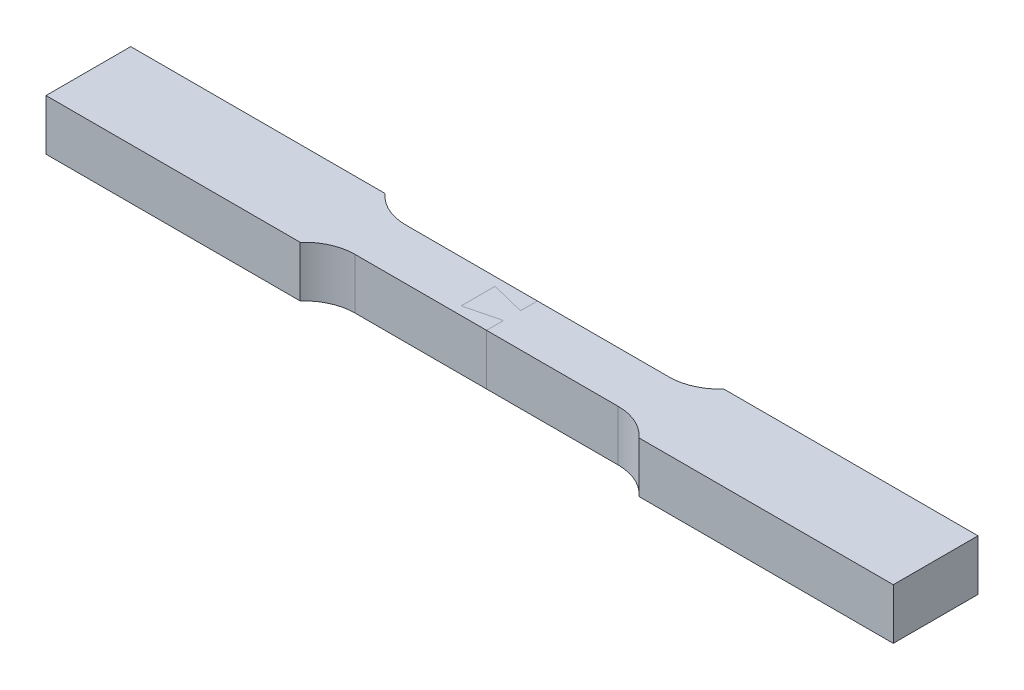
ISO-10303-21;
HEADER;
FILE_DESCRIPTION(('STEP AP214'),'2;1');
FILE_NAME('part.step','',(''),(''),'','','');
FILE_SCHEMA(('AUTOMOTIVE_DESIGN { 1 0 10303 214 1 1 1 1 }'));
ENDSEC;
DATA;
#1=APPLICATION_CONTEXT('core data for automotive mechanical design processes');
#2=APPLICATION_PROTOCOL_DEFINITION('international standard','automotive_design',2000,#1);
#3=PRODUCT_CONTEXT('',#1,'mechanical');
#4=PRODUCT('Part','Part','',(#3));
#5=PRODUCT_RELATED_PRODUCT_CATEGORY('part','',(#4));
#6=PRODUCT_DEFINITION_FORMATION('','',#4);
#7=PRODUCT_DEFINITION_CONTEXT('part definition',#1,'design');
#8=PRODUCT_DEFINITION('design','',#6,#7);
#9=PRODUCT_DEFINITION_SHAPE('','',#8);
#10=(LENGTH_UNIT() NAMED_UNIT(*) SI_UNIT(.MILLI.,.METRE.));
#11=(NAMED_UNIT(*) PLANE_ANGLE_UNIT() SI_UNIT($,.RADIAN.));
#12=(NAMED_UNIT(*) SI_UNIT($,.STERADIAN.) SOLID_ANGLE_UNIT());
#13=UNCERTAINTY_MEASURE_WITH_UNIT(LENGTH_MEASURE(1.E-05),#10,'distance_accuracy_value','');
#14=(GEOMETRIC_REPRESENTATION_CONTEXT(3) GLOBAL_UNCERTAINTY_ASSIGNED_CONTEXT((#13)) GLOBAL_UNIT_ASSIGNED_CONTEXT((#10,
#11,#12)) REPRESENTATION_CONTEXT('',''));
#15=CARTESIAN_POINT('',(0.,0.,0.));
#16=DIRECTION('',(0.,0.,1.));
#17=DIRECTION('',(1.,0.,0.));
#18=AXIS2_PLACEMENT_3D('',#15,#16,#17);
#19=CARTESIAN_POINT('',(0.,6.,3.));
#20=DIRECTION('',(0.,0.,-1.));
#21=DIRECTION('',(-1.,0.,0.));
#22=AXIS2_PLACEMENT_3D('',#19,#20,#21);
#23=PLANE('',#22);
#24=DIRECTION('',(1.,0.,0.));
#25=VECTOR('',#24,1.);
#26=CARTESIAN_POINT('',(0.,0.,3.));
#27=LINE('',#26,#25);
#28=CARTESIAN_POINT('',(0.,0.,3.));
#29=VERTEX_POINT('',#28);
#30=CARTESIAN_POINT('',(15.5278640450004,0.,3.));
#31=VERTEX_POINT('',#30);
#32=EDGE_CURVE('E178',#29,#31,#27,.T.);
#33=ORIENTED_EDGE('',*,*,#32,.T.);
#34=DIRECTION('',(0.,-1.,0.));
#35=VECTOR('',#34,1.);
#36=CARTESIAN_POINT('',(15.5278640450004,6.,3.));
#37=LINE('',#36,#35);
#38=CARTESIAN_POINT('',(15.5278640450004,6.,3.));
#39=VERTEX_POINT('',#38);
#40=EDGE_CURVE('E12',#39,#31,#37,.T.);
#41=ORIENTED_EDGE('',*,*,#40,.F.);
#42=DIRECTION('',(1.,0.,0.));
#43=VECTOR('',#42,1.);
#44=CARTESIAN_POINT('',(0.,6.,3.));
#45=LINE('',#44,#43);
#46=CARTESIAN_POINT('',(0.,6.,3.));
#47=VERTEX_POINT('',#46);
#48=EDGE_CURVE('E221',#47,#39,#45,.T.);
#49=ORIENTED_EDGE('',*,*,#48,.F.);
#50=DIRECTION('',(0.,-1.,0.));
#51=VECTOR('',#50,1.);
#52=CARTESIAN_POINT('',(0.,6.,3.));
#53=LINE('',#52,#51);
#54=EDGE_CURVE('E70',#47,#29,#53,.T.);
#55=ORIENTED_EDGE('',*,*,#54,.T.);
#56=EDGE_LOOP('',(#33,#41,#49,#55));
#57=FACE_BOUND('',#56,.T.);
#58=ADVANCED_FACE('F53',(#57),#23,.F.);
#59=CARTESIAN_POINT('',(15.5278640450004,6.,9.));
#60=DIRECTION('',(0.,-1.,0.));
#61=DIRECTION('',(0.,0.,-1.));
#62=AXIS2_PLACEMENT_3D('',#59,#60,#61);
#63=CYLINDRICAL_SURFACE('',#62,6.);
#64=CARTESIAN_POINT('',(15.5278640450004,0.,9.));
#65=DIRECTION('',(0.,1.,0.));
#66=DIRECTION('',(0.,0.,1.));
#67=AXIS2_PLACEMENT_3D('',#64,#65,#66);
#68=CIRCLE('',#67,6.);
#69=CARTESIAN_POINT('',(20.,0.,5.));
#70=VERTEX_POINT('',#69);
#71=EDGE_CURVE('E181',#31,#70,#68,.F.);
#72=ORIENTED_EDGE('',*,*,#71,.T.);
#73=DIRECTION('',(0.,-1.,0.));
#74=VECTOR('',#73,1.);
#75=CARTESIAN_POINT('',(20.,6.,5.));
#76=LINE('',#75,#74);
#77=CARTESIAN_POINT('',(20.,6.,5.));
#78=VERTEX_POINT('',#77);
#79=EDGE_CURVE('E62',#78,#70,#76,.T.);
#80=ORIENTED_EDGE('',*,*,#79,.F.);
#81=CARTESIAN_POINT('',(15.5278640450004,6.,9.));
#82=DIRECTION('',(0.,1.,0.));
#83=DIRECTION('',(0.,0.,1.));
#84=AXIS2_PLACEMENT_3D('',#81,#82,#83);
#85=CIRCLE('',#84,6.);
#86=EDGE_CURVE('E121',#39,#78,#85,.F.);
#87=ORIENTED_EDGE('',*,*,#86,.F.);
#88=ORIENTED_EDGE('',*,*,#40,.T.);
#89=EDGE_LOOP('',(#72,#80,#87,#88));
#90=FACE_BOUND('',#89,.T.);
#91=ADVANCED_FACE('F253',(#90),#63,.F.);
#92=CARTESIAN_POINT('',(0.,6.,5.));
#93=DIRECTION('',(0.,0.,1.));
#94=DIRECTION('',(1.,0.,0.));
#95=AXIS2_PLACEMENT_3D('',#92,#93,#94);
#96=PLANE('',#95);
#97=DIRECTION('',(-1.,0.,0.));
#98=VECTOR('',#97,1.);
#99=CARTESIAN_POINT('',(0.,0.,5.));
#100=LINE('',#99,#98);
#101=CARTESIAN_POINT('',(50.,0.,5.));
#102=VERTEX_POINT('',#101);
#103=EDGE_CURVE('E185',#102,#70,#100,.T.);
#104=ORIENTED_EDGE('',*,*,#103,.F.);
#105=DIRECTION('',(0.,-1.,0.));
#106=VECTOR('',#105,1.);
#107=CARTESIAN_POINT('',(50.,6.,5.));
#108=LINE('',#107,#106);
#109=CARTESIAN_POINT('',(50.,6.,5.));
#110=VERTEX_POINT('',#109);
#111=EDGE_CURVE('E244',#110,#102,#108,.T.);
#112=ORIENTED_EDGE('',*,*,#111,.F.);
#113=DIRECTION('',(-1.,0.,0.));
#114=VECTOR('',#113,1.);
#115=CARTESIAN_POINT('',(0.,6.,5.));
#116=LINE('',#115,#114);
#117=EDGE_CURVE('E252',#110,#78,#116,.T.);
#118=ORIENTED_EDGE('',*,*,#117,.T.);
#119=ORIENTED_EDGE('',*,*,#79,.T.);
#120=EDGE_LOOP('',(#104,#112,#118,#119));
#121=FACE_BOUND('',#120,.T.);
#122=ADVANCED_FACE('F250',(#121),#96,.T.);
#123=CARTESIAN_POINT('',(50.,6.,0.));
#124=DIRECTION('',(1.,0.,0.));
#125=DIRECTION('',(0.,0.,-1.));
#126=AXIS2_PLACEMENT_3D('',#123,#124,#125);
#127=PLANE('',#126);
#128=DIRECTION('',(0.,0.,1.));
#129=VECTOR('',#128,1.);
#130=CARTESIAN_POINT('',(50.,0.,0.));
#131=LINE('',#130,#129);
#132=CARTESIAN_POINT('',(50.,0.,-5.));
#133=VERTEX_POINT('',#132);
#134=EDGE_CURVE('E189',#133,#102,#131,.T.);
#135=ORIENTED_EDGE('',*,*,#134,.F.);
#136=DIRECTION('',(0.,-1.,0.));
#137=VECTOR('',#136,1.);
#138=CARTESIAN_POINT('',(50.,6.,-5.));
#139=LINE('',#138,#137);
#140=CARTESIAN_POINT('',(50.,6.,-5.));
#141=VERTEX_POINT('',#140);
#142=EDGE_CURVE('E241',#141,#133,#139,.T.);
#143=ORIENTED_EDGE('',*,*,#142,.F.);
#144=DIRECTION('',(0.,0.,1.));
#145=VECTOR('',#144,1.);
#146=CARTESIAN_POINT('',(50.,6.,0.));
#147=LINE('',#146,#145);
#148=EDGE_CURVE('E263',#141,#110,#147,.T.);
#149=ORIENTED_EDGE('',*,*,#148,.T.);
#150=ORIENTED_EDGE('',*,*,#111,.T.);
#151=EDGE_LOOP('',(#135,#143,#149,#150));
#152=FACE_BOUND('',#151,.T.);
#153=ADVANCED_FACE('F260',(#152),#127,.T.);
#154=CARTESIAN_POINT('',(0.,6.,-5.));
#155=DIRECTION('',(0.,0.,-1.));
#156=DIRECTION('',(-1.,0.,0.));
#157=AXIS2_PLACEMENT_3D('',#154,#155,#156);
#158=PLANE('',#157);
#159=DIRECTION('',(1.,0.,0.));
#160=VECTOR('',#159,1.);
#161=CARTESIAN_POINT('',(0.,0.,-5.));
#162=LINE('',#161,#160);
#163=CARTESIAN_POINT('',(20.,0.,-5.));
#164=VERTEX_POINT('',#163);
#165=EDGE_CURVE('E193',#164,#133,#162,.T.);
#166=ORIENTED_EDGE('',*,*,#165,.F.);
#167=DIRECTION('',(0.,-1.,0.));
#168=VECTOR('',#167,1.);
#169=CARTESIAN_POINT('',(20.,6.,-5.));
#170=LINE('',#169,#168);
#171=CARTESIAN_POINT('',(20.,6.,-5.));
#172=VERTEX_POINT('',#171);
#173=EDGE_CURVE('E238',#172,#164,#170,.T.);
#174=ORIENTED_EDGE('',*,*,#173,.F.);
#175=DIRECTION('',(1.,0.,0.));
#176=VECTOR('',#175,1.);
#177=CARTESIAN_POINT('',(0.,6.,-5.));
#178=LINE('',#177,#176);
#179=EDGE_CURVE('E270',#172,#141,#178,.T.);
#180=ORIENTED_EDGE('',*,*,#179,.T.);
#181=ORIENTED_EDGE('',*,*,#142,.T.);
#182=EDGE_LOOP('',(#166,#174,#180,#181));
#183=FACE_BOUND('',#182,.T.);
#184=ADVANCED_FACE('F314',(#183),#158,.T.);
#185=CARTESIAN_POINT('',(15.5278640450004,6.,-9.));
#186=DIRECTION('',(0.,-1.,0.));
#187=DIRECTION('',(0.,0.,-1.));
#188=AXIS2_PLACEMENT_3D('',#185,#186,#187);
#189=CYLINDRICAL_SURFACE('',#188,6.);
#190=CARTESIAN_POINT('',(15.5278640450004,0.,-9.));
#191=DIRECTION('',(0.,1.,0.));
#192=DIRECTION('',(0.,0.,1.));
#193=AXIS2_PLACEMENT_3D('',#190,#191,#192);
#194=CIRCLE('',#193,6.);
#195=CARTESIAN_POINT('',(15.5278640450004,0.,-3.));
#196=VERTEX_POINT('',#195);
#197=EDGE_CURVE('E197',#196,#164,#194,.T.);
#198=ORIENTED_EDGE('',*,*,#197,.F.);
#199=DIRECTION('',(0.,-1.,0.));
#200=VECTOR('',#199,1.);
#201=CARTESIAN_POINT('',(15.5278640450004,6.,-3.));
#202=LINE('',#201,#200);
#203=CARTESIAN_POINT('',(15.5278640450004,6.,-3.));
#204=VERTEX_POINT('',#203);
#205=EDGE_CURVE('E235',#204,#196,#202,.T.);
#206=ORIENTED_EDGE('',*,*,#205,.F.);
#207=CARTESIAN_POINT('',(15.5278640450004,6.,-9.));
#208=DIRECTION('',(0.,1.,0.));
#209=DIRECTION('',(0.,0.,1.));
#210=AXIS2_PLACEMENT_3D('',#207,#208,#209);
#211=CIRCLE('',#210,6.);
#212=EDGE_CURVE('E277',#204,#172,#211,.T.);
#213=ORIENTED_EDGE('',*,*,#212,.T.);
#214=ORIENTED_EDGE('',*,*,#173,.T.);
#215=EDGE_LOOP('',(#198,#206,#213,#214));
#216=FACE_BOUND('',#215,.T.);
#217=ADVANCED_FACE('F317',(#216),#189,.F.);
#218=CARTESIAN_POINT('',(0.,6.,-3.));
#219=DIRECTION('',(0.,0.,1.));
#220=DIRECTION('',(1.,0.,0.));
#221=AXIS2_PLACEMENT_3D('',#218,#219,#220);
#222=PLANE('',#221);
#223=DIRECTION('',(-1.,0.,0.));
#224=VECTOR('',#223,1.);
#225=CARTESIAN_POINT('',(0.,0.,-3.));
#226=LINE('',#225,#224);
#227=CARTESIAN_POINT('',(0.,0.,-3.));
#228=VERTEX_POINT('',#227);
#229=EDGE_CURVE('E201',#196,#228,#226,.T.);
#230=ORIENTED_EDGE('',*,*,#229,.T.);
#231=DIRECTION('',(0.,-1.,0.));
#232=VECTOR('',#231,1.);
#233=CARTESIAN_POINT('',(0.,6.,-3.));
#234=LINE('',#233,#232);
#235=CARTESIAN_POINT('',(0.,6.,-3.));
#236=VERTEX_POINT('',#235);
#237=EDGE_CURVE('E231',#236,#228,#234,.T.);
#238=ORIENTED_EDGE('',*,*,#237,.F.);
#239=DIRECTION('',(-1.,0.,0.));
#240=VECTOR('',#239,1.);
#241=CARTESIAN_POINT('',(0.,6.,-3.));
#242=LINE('',#241,#240);
#243=EDGE_CURVE('E281',#204,#236,#242,.T.);
#244=ORIENTED_EDGE('',*,*,#243,.F.);
#245=ORIENTED_EDGE('',*,*,#205,.T.);
#246=EDGE_LOOP('',(#230,#238,#244,#245));
#247=FACE_BOUND('',#246,.T.);
#248=ADVANCED_FACE('F321',(#247),#222,.F.);
#249=CARTESIAN_POINT('',(0.,6.,0.));
#250=DIRECTION('',(1.,0.,0.));
#251=DIRECTION('',(0.,0.,-1.));
#252=AXIS2_PLACEMENT_3D('',#249,#250,#251);
#253=PLANE('',#252);
#254=DIRECTION('',(0.,0.,1.));
#255=VECTOR('',#254,1.);
#256=CARTESIAN_POINT('',(0.,0.,0.));
#257=LINE('',#256,#255);
#258=CARTESIAN_POINT('',(0.,0.,-1.));
#259=VERTEX_POINT('',#258);
#260=EDGE_CURVE('E204',#228,#259,#257,.T.);
#261=ORIENTED_EDGE('',*,*,#260,.T.);
#262=DIRECTION('',(0.,-1.,0.));
#263=VECTOR('',#262,1.);
#264=CARTESIAN_POINT('',(0.,6.,-1.));
#265=LINE('',#264,#263);
#266=CARTESIAN_POINT('',(0.,6.,-1.));
#267=VERTEX_POINT('',#266);
#268=EDGE_CURVE('E228',#267,#259,#265,.T.);
#269=ORIENTED_EDGE('',*,*,#268,.F.);
#270=DIRECTION('',(0.,0.,1.));
#271=VECTOR('',#270,1.);
#272=CARTESIAN_POINT('',(0.,6.,0.));
#273=LINE('',#272,#271);
#274=EDGE_CURVE('E284',#236,#267,#273,.T.);
#275=ORIENTED_EDGE('',*,*,#274,.F.);
#276=ORIENTED_EDGE('',*,*,#237,.T.);
#277=EDGE_LOOP('',(#261,#269,#275,#276));
#278=FACE_BOUND('',#277,.T.);
#279=ADVANCED_FACE('F325',(#278),#253,.F.);
#280=CARTESIAN_POINT('',(0.235294117647059,6.,-0.941176470588236));
#281=DIRECTION('',(0.242535625036333,0.,-0.970142500145332));
#282=DIRECTION('',(-0.970142500145332,0.,-0.242535625036333));
#283=AXIS2_PLACEMENT_3D('',#280,#281,#282);
#284=PLANE('',#283);
#285=DIRECTION('',(0.970142500145332,0.,0.242535625036333));
#286=VECTOR('',#285,1.);
#287=CARTESIAN_POINT('',(0.235294117647059,0.,-0.941176470588236));
#288=LINE('',#287,#286);
#289=CARTESIAN_POINT('',(-4.,0.,-2.));
#290=VERTEX_POINT('',#289);
#291=EDGE_CURVE('E208',#290,#259,#288,.T.);
#292=ORIENTED_EDGE('',*,*,#291,.F.);
#293=DIRECTION('',(0.,-1.,0.));
#294=VECTOR('',#293,1.);
#295=CARTESIAN_POINT('',(-4.,6.,-2.));
#296=LINE('',#295,#294);
#297=CARTESIAN_POINT('',(-4.,6.,-2.));
#298=VERTEX_POINT('',#297);
#299=EDGE_CURVE('E168',#298,#290,#296,.T.);
#300=ORIENTED_EDGE('',*,*,#299,.F.);
#301=DIRECTION('',(0.970142500145332,0.,0.242535625036333));
#302=VECTOR('',#301,1.);
#303=CARTESIAN_POINT('',(0.235294117647059,6.,-0.941176470588236));
#304=LINE('',#303,#302);
#305=EDGE_CURVE('E156',#298,#267,#304,.T.);
#306=ORIENTED_EDGE('',*,*,#305,.T.);
#307=ORIENTED_EDGE('',*,*,#268,.T.);
#308=EDGE_LOOP('',(#292,#300,#306,#307));
#309=FACE_BOUND('',#308,.T.);
#310=ADVANCED_FACE('F289',(#309),#284,.T.);
#311=CARTESIAN_POINT('',(-4.,6.,0.));
#312=DIRECTION('',(1.,0.,0.));
#313=DIRECTION('',(0.,0.,-1.));
#314=AXIS2_PLACEMENT_3D('',#311,#312,#313);
#315=PLANE('',#314);
#316=DIRECTION('',(0.,0.,1.));
#317=VECTOR('',#316,1.);
#318=CARTESIAN_POINT('',(-4.,0.,0.));
#319=LINE('',#318,#317);
#320=CARTESIAN_POINT('',(-4.,0.,2.));
#321=VERTEX_POINT('',#320);
#322=EDGE_CURVE('E164',#290,#321,#319,.T.);
#323=ORIENTED_EDGE('',*,*,#322,.T.);
#324=DIRECTION('',(0.,-1.,0.));
#325=VECTOR('',#324,1.);
#326=CARTESIAN_POINT('',(-4.,6.,2.));
#327=LINE('',#326,#325);
#328=CARTESIAN_POINT('',(-4.,6.,2.));
#329=VERTEX_POINT('',#328);
#330=EDGE_CURVE('E161',#329,#321,#327,.T.);
#331=ORIENTED_EDGE('',*,*,#330,.F.);
#332=DIRECTION('',(0.,0.,1.));
#333=VECTOR('',#332,1.);
#334=CARTESIAN_POINT('',(-4.,6.,0.));
#335=LINE('',#334,#333);
#336=EDGE_CURVE('E149',#298,#329,#335,.T.);
#337=ORIENTED_EDGE('',*,*,#336,.F.);
#338=ORIENTED_EDGE('',*,*,#299,.T.);
#339=EDGE_LOOP('',(#323,#331,#337,#338));
#340=FACE_BOUND('',#339,.T.);
#341=ADVANCED_FACE('F162',(#340),#315,.F.);
#342=CARTESIAN_POINT('',(0.235294117647059,6.,0.941176470588236));
#343=DIRECTION('',(-0.242535625036333,0.,-0.970142500145332));
#344=DIRECTION('',(-0.970142500145332,0.,0.242535625036333));
#345=AXIS2_PLACEMENT_3D('',#342,#343,#344);
#346=PLANE('',#345);
#347=DIRECTION('',(0.970142500145332,0.,-0.242535625036333));
#348=VECTOR('',#347,1.);
#349=CARTESIAN_POINT('',(0.235294117647059,0.,0.941176470588236));
#350=LINE('',#349,#348);
#351=CARTESIAN_POINT('',(0.,0.,1.));
#352=VERTEX_POINT('',#351);
#353=EDGE_CURVE('E214',#321,#352,#350,.T.);
#354=ORIENTED_EDGE('',*,*,#353,.T.);
#355=DIRECTION('',(0.,-1.,0.));
#356=VECTOR('',#355,1.);
#357=CARTESIAN_POINT('',(0.,6.,1.));
#358=LINE('',#357,#356);
#359=CARTESIAN_POINT('',(0.,6.,1.));
#360=VERTEX_POINT('',#359);
#361=EDGE_CURVE('E109',#360,#352,#358,.T.);
#362=ORIENTED_EDGE('',*,*,#361,.F.);
#363=DIRECTION('',(0.970142500145332,0.,-0.242535625036333));
#364=VECTOR('',#363,1.);
#365=CARTESIAN_POINT('',(0.235294117647059,6.,0.941176470588236));
#366=LINE('',#365,#364);
#367=EDGE_CURVE('E154',#329,#360,#366,.T.);
#368=ORIENTED_EDGE('',*,*,#367,.F.);
#369=ORIENTED_EDGE('',*,*,#330,.T.);
#370=EDGE_LOOP('',(#354,#362,#368,#369));
#371=FACE_BOUND('',#370,.T.);
#372=ADVANCED_FACE('F170',(#371),#346,.F.);
#373=CARTESIAN_POINT('',(0.,6.,0.));
#374=DIRECTION('',(-1.,0.,0.));
#375=DIRECTION('',(0.,0.,1.));
#376=AXIS2_PLACEMENT_3D('',#373,#374,#375);
#377=PLANE('',#376);
#378=DIRECTION('',(0.,0.,-1.));
#379=VECTOR('',#378,1.);
#380=CARTESIAN_POINT('',(0.,0.,0.));
#381=LINE('',#380,#379);
#382=EDGE_CURVE('E217',#29,#352,#381,.T.);
#383=ORIENTED_EDGE('',*,*,#382,.F.);
#384=ORIENTED_EDGE('',*,*,#54,.F.);
#385=DIRECTION('',(0.,0.,-1.));
#386=VECTOR('',#385,1.);
#387=CARTESIAN_POINT('',(0.,6.,0.));
#388=LINE('',#387,#386);
#389=EDGE_CURVE('E172',#47,#360,#388,.T.);
#390=ORIENTED_EDGE('',*,*,#389,.T.);
#391=ORIENTED_EDGE('',*,*,#361,.T.);
#392=EDGE_LOOP('',(#383,#384,#390,#391));
#393=FACE_BOUND('',#392,.T.);
#394=ADVANCED_FACE('F292',(#393),#377,.T.);
#395=CARTESIAN_POINT('',(0.,6.,0.));
#396=DIRECTION('',(0.,1.,0.));
#397=DIRECTION('',(0.,0.,1.));
#398=AXIS2_PLACEMENT_3D('',#395,#396,#397);
#399=PLANE('',#398);
#400=ORIENTED_EDGE('',*,*,#48,.T.);
#401=ORIENTED_EDGE('',*,*,#86,.T.);
#402=ORIENTED_EDGE('',*,*,#117,.F.);
#403=ORIENTED_EDGE('',*,*,#148,.F.);
#404=ORIENTED_EDGE('',*,*,#179,.F.);
#405=ORIENTED_EDGE('',*,*,#212,.F.);
#406=ORIENTED_EDGE('',*,*,#243,.T.);
#407=ORIENTED_EDGE('',*,*,#274,.T.);
#408=ORIENTED_EDGE('',*,*,#305,.F.);
#409=ORIENTED_EDGE('',*,*,#336,.T.);
#410=ORIENTED_EDGE('',*,*,#367,.T.);
#411=ORIENTED_EDGE('',*,*,#389,.F.);
#412=EDGE_LOOP('',(#400,#401,#402,#403,#404,#405,#406,#407,#408,#409,#410,#411));
#413=FACE_BOUND('',#412,.T.);
#414=ADVANCED_FACE('F151',(#413),#399,.T.);
#415=CARTESIAN_POINT('',(0.,0.,0.));
#416=DIRECTION('',(0.,1.,0.));
#417=DIRECTION('',(0.,0.,1.));
#418=AXIS2_PLACEMENT_3D('',#415,#416,#417);
#419=PLANE('',#418);
#420=ORIENTED_EDGE('',*,*,#32,.F.);
#421=ORIENTED_EDGE('',*,*,#382,.T.);
#422=ORIENTED_EDGE('',*,*,#353,.F.);
#423=ORIENTED_EDGE('',*,*,#322,.F.);
#424=ORIENTED_EDGE('',*,*,#291,.T.);
#425=ORIENTED_EDGE('',*,*,#260,.F.);
#426=ORIENTED_EDGE('',*,*,#229,.F.);
#427=ORIENTED_EDGE('',*,*,#197,.T.);
#428=ORIENTED_EDGE('',*,*,#165,.T.);
#429=ORIENTED_EDGE('',*,*,#134,.T.);
#430=ORIENTED_EDGE('',*,*,#103,.T.);
#431=ORIENTED_EDGE('',*,*,#71,.F.);
#432=EDGE_LOOP('',(#420,#421,#422,#423,#424,#425,#426,#427,#428,#429,#430,#431));
#433=FACE_BOUND('',#432,.T.);
#434=ADVANCED_FACE('F256',(#433),#419,.F.);
#435=CLOSED_SHELL('',(#58,#91,#122,#153,#184,#217,#248,#279,#310,#341,#372,#394,#414,#434));
#436=MANIFOLD_SOLID_BREP('B2',#435);
#437=CARTESIAN_POINT('',(-15.5278640450004,6.,9.));
#438=DIRECTION('',(0.,-1.,0.));
#439=DIRECTION('',(0.,0.,-1.));
#440=AXIS2_PLACEMENT_3D('',#437,#438,#439);
#441=CYLINDRICAL_SURFACE('',#440,6.);
#442=CARTESIAN_POINT('',(-15.5278640450004,0.,9.));
#443=DIRECTION('',(0.,1.,0.));
#444=DIRECTION('',(0.,0.,1.));
#445=AXIS2_PLACEMENT_3D('',#442,#443,#444);
#446=CIRCLE('',#445,6.);
#447=CARTESIAN_POINT('',(-15.5278640450004,0.,3.));
#448=VERTEX_POINT('',#447);
#449=CARTESIAN_POINT('',(-20.,0.,5.));
#450=VERTEX_POINT('',#449);
#451=EDGE_CURVE('E538',#448,#450,#446,.T.);
#452=ORIENTED_EDGE('',*,*,#451,.F.);
#453=DIRECTION('',(0.,-1.,0.));
#454=VECTOR('',#453,1.);
#455=CARTESIAN_POINT('',(-15.5278640450004,6.,3.));
#456=LINE('',#455,#454);
#457=CARTESIAN_POINT('',(-15.5278640450004,6.,3.));
#458=VERTEX_POINT('',#457);
#459=EDGE_CURVE('E51',#458,#448,#456,.T.);
#460=ORIENTED_EDGE('',*,*,#459,.F.);
#461=CARTESIAN_POINT('',(-15.5278640450004,6.,9.));
#462=DIRECTION('',(0.,1.,0.));
#463=DIRECTION('',(0.,0.,1.));
#464=AXIS2_PLACEMENT_3D('',#461,#462,#463);
#465=CIRCLE('',#464,6.);
#466=CARTESIAN_POINT('',(-20.,6.,5.));
#467=VERTEX_POINT('',#466);
#468=EDGE_CURVE('E566',#458,#467,#465,.T.);
#469=ORIENTED_EDGE('',*,*,#468,.T.);
#470=DIRECTION('',(0.,-1.,0.));
#471=VECTOR('',#470,1.);
#472=CARTESIAN_POINT('',(-20.,6.,5.));
#473=LINE('',#472,#471);
#474=EDGE_CURVE('E484',#467,#450,#473,.T.);
#475=ORIENTED_EDGE('',*,*,#474,.T.);
#476=EDGE_LOOP('',(#452,#460,#469,#475));
#477=FACE_BOUND('',#476,.T.);
#478=ADVANCED_FACE('F421',(#477),#441,.F.);
#479=CARTESIAN_POINT('',(0.,6.,3.));
#480=DIRECTION('',(0.,0.,-1.));
#481=DIRECTION('',(-1.,0.,0.));
#482=AXIS2_PLACEMENT_3D('',#479,#480,#481);
#483=PLANE('',#482);
#484=DIRECTION('',(1.,0.,0.));
#485=VECTOR('',#484,1.);
#486=CARTESIAN_POINT('',(0.,0.,3.));
#487=LINE('',#486,#485);
#488=CARTESIAN_POINT('',(0.,0.,3.));
#489=VERTEX_POINT('',#488);
#490=EDGE_CURVE('E541',#448,#489,#487,.T.);
#491=ORIENTED_EDGE('',*,*,#490,.T.);
#492=DIRECTION('',(0.,-1.,0.));
#493=VECTOR('',#492,1.);
#494=CARTESIAN_POINT('',(0.,6.,3.));
#495=LINE('',#494,#493);
#496=CARTESIAN_POINT('',(0.,6.,3.));
#497=VERTEX_POINT('',#496);
#498=EDGE_CURVE('E429',#497,#489,#495,.T.);
#499=ORIENTED_EDGE('',*,*,#498,.F.);
#500=DIRECTION('',(1.,0.,0.));
#501=VECTOR('',#500,1.);
#502=CARTESIAN_POINT('',(0.,6.,3.));
#503=LINE('',#502,#501);
#504=EDGE_CURVE('E608',#458,#497,#503,.T.);
#505=ORIENTED_EDGE('',*,*,#504,.F.);
#506=ORIENTED_EDGE('',*,*,#459,.T.);
#507=EDGE_LOOP('',(#491,#499,#505,#506));
#508=FACE_BOUND('',#507,.T.);
#509=ADVANCED_FACE('F630',(#508),#483,.F.);
#510=CARTESIAN_POINT('',(0.,6.,0.));
#511=DIRECTION('',(-1.,0.,0.));
#512=DIRECTION('',(0.,0.,1.));
#513=AXIS2_PLACEMENT_3D('',#510,#511,#512);
#514=PLANE('',#513);
#515=DIRECTION('',(0.,0.,-1.));
#516=VECTOR('',#515,1.);
#517=CARTESIAN_POINT('',(0.,0.,0.));
#518=LINE('',#517,#516);
#519=CARTESIAN_POINT('',(0.,0.,1.));
#520=VERTEX_POINT('',#519);
#521=EDGE_CURVE('E543',#489,#520,#518,.T.);
#522=ORIENTED_EDGE('',*,*,#521,.T.);
#523=DIRECTION('',(0.,-1.,0.));
#524=VECTOR('',#523,1.);
#525=CARTESIAN_POINT('',(0.,6.,1.));
#526=LINE('',#525,#524);
#527=CARTESIAN_POINT('',(0.,6.,1.));
#528=VERTEX_POINT('',#527);
#529=EDGE_CURVE('E581',#528,#520,#526,.T.);
#530=ORIENTED_EDGE('',*,*,#529,.F.);
#531=DIRECTION('',(0.,0.,-1.));
#532=VECTOR('',#531,1.);
#533=CARTESIAN_POINT('',(0.,6.,0.));
#534=LINE('',#533,#532);
#535=EDGE_CURVE('E589',#497,#528,#534,.T.);
#536=ORIENTED_EDGE('',*,*,#535,.F.);
#537=ORIENTED_EDGE('',*,*,#498,.T.);
#538=EDGE_LOOP('',(#522,#530,#536,#537));
#539=FACE_BOUND('',#538,.T.);
#540=ADVANCED_FACE('F587',(#539),#514,.F.);
#541=CARTESIAN_POINT('',(0.235294117647059,6.,0.941176470588236));
#542=DIRECTION('',(-0.242535625036333,0.,-0.970142500145332));
#543=DIRECTION('',(-0.970142500145332,0.,0.242535625036333));
#544=AXIS2_PLACEMENT_3D('',#541,#542,#543);
#545=PLANE('',#544);
#546=DIRECTION('',(0.970142500145332,0.,-0.242535625036333));
#547=VECTOR('',#546,1.);
#548=CARTESIAN_POINT('',(0.235294117647059,0.,0.941176470588236));
#549=LINE('',#548,#547);
#550=CARTESIAN_POINT('',(-4.,0.,2.));
#551=VERTEX_POINT('',#550);
#552=EDGE_CURVE('E546',#551,#520,#549,.T.);
#553=ORIENTED_EDGE('',*,*,#552,.F.);
#554=DIRECTION('',(0.,-1.,0.));
#555=VECTOR('',#554,1.);
#556=CARTESIAN_POINT('',(-4.,6.,2.));
#557=LINE('',#556,#555);
#558=CARTESIAN_POINT('',(-4.,6.,2.));
#559=VERTEX_POINT('',#558);
#560=EDGE_CURVE('E579',#559,#551,#557,.T.);
#561=ORIENTED_EDGE('',*,*,#560,.F.);
#562=DIRECTION('',(0.970142500145332,0.,-0.242535625036333));
#563=VECTOR('',#562,1.);
#564=CARTESIAN_POINT('',(0.235294117647059,6.,0.941176470588236));
#565=LINE('',#564,#563);
#566=EDGE_CURVE('E601',#559,#528,#565,.T.);
#567=ORIENTED_EDGE('',*,*,#566,.T.);
#568=ORIENTED_EDGE('',*,*,#529,.T.);
#569=EDGE_LOOP('',(#553,#561,#567,#568));
#570=FACE_BOUND('',#569,.T.);
#571=ADVANCED_FACE('F598',(#570),#545,.T.);
#572=CARTESIAN_POINT('',(-4.,6.,0.));
#573=DIRECTION('',(1.,0.,0.));
#574=DIRECTION('',(0.,0.,-1.));
#575=AXIS2_PLACEMENT_3D('',#572,#573,#574);
#576=PLANE('',#575);
#577=DIRECTION('',(0.,0.,1.));
#578=VECTOR('',#577,1.);
#579=CARTESIAN_POINT('',(-4.,0.,0.));
#580=LINE('',#579,#578);
#581=CARTESIAN_POINT('',(-4.,0.,-2.));
#582=VERTEX_POINT('',#581);
#583=EDGE_CURVE('E549',#582,#551,#580,.T.);
#584=ORIENTED_EDGE('',*,*,#583,.F.);
#585=DIRECTION('',(0.,-1.,0.));
#586=VECTOR('',#585,1.);
#587=CARTESIAN_POINT('',(-4.,6.,-2.));
#588=LINE('',#587,#586);
#589=CARTESIAN_POINT('',(-4.,6.,-2.));
#590=VERTEX_POINT('',#589);
#591=EDGE_CURVE('E577',#590,#582,#588,.T.);
#592=ORIENTED_EDGE('',*,*,#591,.F.);
#593=DIRECTION('',(0.,0.,1.));
#594=VECTOR('',#593,1.);
#595=CARTESIAN_POINT('',(-4.,6.,0.));
#596=LINE('',#595,#594);
#597=EDGE_CURVE('E604',#590,#559,#596,.T.);
#598=ORIENTED_EDGE('',*,*,#597,.T.);
#599=ORIENTED_EDGE('',*,*,#560,.T.);
#600=EDGE_LOOP('',(#584,#592,#598,#599));
#601=FACE_BOUND('',#600,.T.);
#602=ADVANCED_FACE('F640',(#601),#576,.T.);
#603=CARTESIAN_POINT('',(0.235294117647059,6.,-0.941176470588236));
#604=DIRECTION('',(0.242535625036333,0.,-0.970142500145332));
#605=DIRECTION('',(-0.970142500145332,0.,-0.242535625036333));
#606=AXIS2_PLACEMENT_3D('',#603,#604,#605);
#607=PLANE('',#606);
#608=DIRECTION('',(0.970142500145332,0.,0.242535625036333));
#609=VECTOR('',#608,1.);
#610=CARTESIAN_POINT('',(0.235294117647059,0.,-0.941176470588236));
#611=LINE('',#610,#609);
#612=CARTESIAN_POINT('',(0.,0.,-1.));
#613=VERTEX_POINT('',#612);
#614=EDGE_CURVE('E552',#582,#613,#611,.T.);
#615=ORIENTED_EDGE('',*,*,#614,.T.);
#616=DIRECTION('',(0.,-1.,0.));
#617=VECTOR('',#616,1.);
#618=CARTESIAN_POINT('',(0.,6.,-1.));
#619=LINE('',#618,#617);
#620=CARTESIAN_POINT('',(0.,6.,-1.));
#621=VERTEX_POINT('',#620);
#622=EDGE_CURVE('E575',#621,#613,#619,.T.);
#623=ORIENTED_EDGE('',*,*,#622,.F.);
#624=DIRECTION('',(0.970142500145332,0.,0.242535625036333));
#625=VECTOR('',#624,1.);
#626=CARTESIAN_POINT('',(0.235294117647059,6.,-0.941176470588236));
#627=LINE('',#626,#625);
#628=EDGE_CURVE('E606',#590,#621,#627,.T.);
#629=ORIENTED_EDGE('',*,*,#628,.F.);
#630=ORIENTED_EDGE('',*,*,#591,.T.);
#631=EDGE_LOOP('',(#615,#623,#629,#630));
#632=FACE_BOUND('',#631,.T.);
#633=ADVANCED_FACE('F643',(#632),#607,.F.);
#634=CARTESIAN_POINT('',(0.,6.,0.));
#635=DIRECTION('',(1.,0.,0.));
#636=DIRECTION('',(0.,0.,-1.));
#637=AXIS2_PLACEMENT_3D('',#634,#635,#636);
#638=PLANE('',#637);
#639=DIRECTION('',(0.,0.,1.));
#640=VECTOR('',#639,1.);
#641=CARTESIAN_POINT('',(0.,0.,0.));
#642=LINE('',#641,#640);
#643=CARTESIAN_POINT('',(0.,0.,-3.));
#644=VERTEX_POINT('',#643);
#645=EDGE_CURVE('E555',#644,#613,#642,.T.);
#646=ORIENTED_EDGE('',*,*,#645,.F.);
#647=DIRECTION('',(0.,-1.,0.));
#648=VECTOR('',#647,1.);
#649=CARTESIAN_POINT('',(0.,6.,-3.));
#650=LINE('',#649,#648);
#651=CARTESIAN_POINT('',(0.,6.,-3.));
#652=VERTEX_POINT('',#651);
#653=EDGE_CURVE('E573',#652,#644,#650,.T.);
#654=ORIENTED_EDGE('',*,*,#653,.F.);
#655=DIRECTION('',(0.,0.,1.));
#656=VECTOR('',#655,1.);
#657=CARTESIAN_POINT('',(0.,6.,0.));
#658=LINE('',#657,#656);
#659=EDGE_CURVE('E613',#652,#621,#658,.T.);
#660=ORIENTED_EDGE('',*,*,#659,.T.);
#661=ORIENTED_EDGE('',*,*,#622,.T.);
#662=EDGE_LOOP('',(#646,#654,#660,#661));
#663=FACE_BOUND('',#662,.T.);
#664=ADVANCED_FACE('F647',(#663),#638,.T.);
#665=CARTESIAN_POINT('',(0.,6.,-3.));
#666=DIRECTION('',(0.,0.,1.));
#667=DIRECTION('',(1.,0.,0.));
#668=AXIS2_PLACEMENT_3D('',#665,#666,#667);
#669=PLANE('',#668);
#670=DIRECTION('',(-1.,0.,0.));
#671=VECTOR('',#670,1.);
#672=CARTESIAN_POINT('',(0.,0.,-3.));
#673=LINE('',#672,#671);
#674=CARTESIAN_POINT('',(-15.5278640450004,0.,-3.));
#675=VERTEX_POINT('',#674);
#676=EDGE_CURVE('E558',#644,#675,#673,.T.);
#677=ORIENTED_EDGE('',*,*,#676,.T.);
#678=DIRECTION('',(0.,-1.,0.));
#679=VECTOR('',#678,1.);
#680=CARTESIAN_POINT('',(-15.5278640450004,6.,-3.));
#681=LINE('',#680,#679);
#682=CARTESIAN_POINT('',(-15.5278640450004,6.,-3.));
#683=VERTEX_POINT('',#682);
#684=EDGE_CURVE('E570',#683,#675,#681,.T.);
#685=ORIENTED_EDGE('',*,*,#684,.F.);
#686=DIRECTION('',(-1.,0.,0.));
#687=VECTOR('',#686,1.);
#688=CARTESIAN_POINT('',(0.,6.,-3.));
#689=LINE('',#688,#687);
#690=EDGE_CURVE('E616',#652,#683,#689,.T.);
#691=ORIENTED_EDGE('',*,*,#690,.F.);
#692=ORIENTED_EDGE('',*,*,#653,.T.);
#693=EDGE_LOOP('',(#677,#685,#691,#692));
#694=FACE_BOUND('',#693,.T.);
#695=ADVANCED_FACE('F621',(#694),#669,.F.);
#696=CARTESIAN_POINT('',(-15.5278640450004,6.,-9.));
#697=DIRECTION('',(0.,-1.,0.));
#698=DIRECTION('',(0.,0.,-1.));
#699=AXIS2_PLACEMENT_3D('',#696,#697,#698);
#700=CYLINDRICAL_SURFACE('',#699,6.);
#701=CARTESIAN_POINT('',(-15.5278640450004,0.,-9.));
#702=DIRECTION('',(0.,1.,0.));
#703=DIRECTION('',(0.,0.,1.));
#704=AXIS2_PLACEMENT_3D('',#701,#702,#703);
#705=CIRCLE('',#704,6.);
#706=CARTESIAN_POINT('',(-20.,0.,-5.));
#707=VERTEX_POINT('',#706);
#708=EDGE_CURVE('E560',#675,#707,#705,.F.);
#709=ORIENTED_EDGE('',*,*,#708,.T.);
#710=DIRECTION('',(0.,-1.,0.));
#711=VECTOR('',#710,1.);
#712=CARTESIAN_POINT('',(-20.,6.,-5.));
#713=LINE('',#712,#711);
#714=CARTESIAN_POINT('',(-20.,6.,-5.));
#715=VERTEX_POINT('',#714);
#716=EDGE_CURVE('E530',#715,#707,#713,.T.);
#717=ORIENTED_EDGE('',*,*,#716,.F.);
#718=CARTESIAN_POINT('',(-15.5278640450004,6.,-9.));
#719=DIRECTION('',(0.,1.,0.));
#720=DIRECTION('',(0.,0.,1.));
#721=AXIS2_PLACEMENT_3D('',#718,#719,#720);
#722=CIRCLE('',#721,6.);
#723=EDGE_CURVE('E521',#683,#715,#722,.F.);
#724=ORIENTED_EDGE('',*,*,#723,.F.);
#725=ORIENTED_EDGE('',*,*,#684,.T.);
#726=EDGE_LOOP('',(#709,#717,#724,#725));
#727=FACE_BOUND('',#726,.T.);
#728=ADVANCED_FACE('F625',(#727),#700,.F.);
#729=CARTESIAN_POINT('',(0.,6.,-5.));
#730=DIRECTION('',(0.,0.,1.));
#731=DIRECTION('',(1.,0.,0.));
#732=AXIS2_PLACEMENT_3D('',#729,#730,#731);
#733=PLANE('',#732);
#734=DIRECTION('',(-1.,0.,0.));
#735=VECTOR('',#734,1.);
#736=CARTESIAN_POINT('',(0.,0.,-5.));
#737=LINE('',#736,#735);
#738=CARTESIAN_POINT('',(-50.,0.,-5.));
#739=VERTEX_POINT('',#738);
#740=EDGE_CURVE('E529',#707,#739,#737,.T.);
#741=ORIENTED_EDGE('',*,*,#740,.T.);
#742=DIRECTION('',(0.,-1.,0.));
#743=VECTOR('',#742,1.);
#744=CARTESIAN_POINT('',(-50.,6.,-5.));
#745=LINE('',#744,#743);
#746=CARTESIAN_POINT('',(-50.,6.,-5.));
#747=VERTEX_POINT('',#746);
#748=EDGE_CURVE('E526',#747,#739,#745,.T.);
#749=ORIENTED_EDGE('',*,*,#748,.F.);
#750=DIRECTION('',(-1.,0.,0.));
#751=VECTOR('',#750,1.);
#752=CARTESIAN_POINT('',(0.,6.,-5.));
#753=LINE('',#752,#751);
#754=EDGE_CURVE('E515',#715,#747,#753,.T.);
#755=ORIENTED_EDGE('',*,*,#754,.F.);
#756=ORIENTED_EDGE('',*,*,#716,.T.);
#757=EDGE_LOOP('',(#741,#749,#755,#756));
#758=FACE_BOUND('',#757,.T.);
#759=ADVANCED_FACE('F527',(#758),#733,.F.);
#760=CARTESIAN_POINT('',(-50.,6.,0.));
#761=DIRECTION('',(1.,0.,0.));
#762=DIRECTION('',(0.,0.,-1.));
#763=AXIS2_PLACEMENT_3D('',#760,#761,#762);
#764=PLANE('',#763);
#765=DIRECTION('',(0.,0.,1.));
#766=VECTOR('',#765,1.);
#767=CARTESIAN_POINT('',(-50.,0.,0.));
#768=LINE('',#767,#766);
#769=CARTESIAN_POINT('',(-50.,0.,5.));
#770=VERTEX_POINT('',#769);
#771=EDGE_CURVE('E477',#739,#770,#768,.T.);
#772=ORIENTED_EDGE('',*,*,#771,.T.);
#773=DIRECTION('',(0.,-1.,0.));
#774=VECTOR('',#773,1.);
#775=CARTESIAN_POINT('',(-50.,6.,5.));
#776=LINE('',#775,#774);
#777=CARTESIAN_POINT('',(-50.,6.,5.));
#778=VERTEX_POINT('',#777);
#779=EDGE_CURVE('E531',#778,#770,#776,.T.);
#780=ORIENTED_EDGE('',*,*,#779,.F.);
#781=DIRECTION('',(0.,0.,1.));
#782=VECTOR('',#781,1.);
#783=CARTESIAN_POINT('',(-50.,6.,0.));
#784=LINE('',#783,#782);
#785=EDGE_CURVE('E519',#747,#778,#784,.T.);
#786=ORIENTED_EDGE('',*,*,#785,.F.);
#787=ORIENTED_EDGE('',*,*,#748,.T.);
#788=EDGE_LOOP('',(#772,#780,#786,#787));
#789=FACE_BOUND('',#788,.T.);
#790=ADVANCED_FACE('F533',(#789),#764,.F.);
#791=CARTESIAN_POINT('',(0.,6.,5.));
#792=DIRECTION('',(0.,0.,-1.));
#793=DIRECTION('',(-1.,0.,0.));
#794=AXIS2_PLACEMENT_3D('',#791,#792,#793);
#795=PLANE('',#794);
#796=DIRECTION('',(1.,0.,0.));
#797=VECTOR('',#796,1.);
#798=CARTESIAN_POINT('',(0.,0.,5.));
#799=LINE('',#798,#797);
#800=EDGE_CURVE('E564',#770,#450,#799,.T.);
#801=ORIENTED_EDGE('',*,*,#800,.T.);
#802=ORIENTED_EDGE('',*,*,#474,.F.);
#803=DIRECTION('',(1.,0.,0.));
#804=VECTOR('',#803,1.);
#805=CARTESIAN_POINT('',(0.,6.,5.));
#806=LINE('',#805,#804);
#807=EDGE_CURVE('E437',#778,#467,#806,.T.);
#808=ORIENTED_EDGE('',*,*,#807,.F.);
#809=ORIENTED_EDGE('',*,*,#779,.T.);
#810=EDGE_LOOP('',(#801,#802,#808,#809));
#811=FACE_BOUND('',#810,.T.);
#812=ADVANCED_FACE('F628',(#811),#795,.F.);
#813=CARTESIAN_POINT('',(0.,6.,0.));
#814=DIRECTION('',(0.,1.,0.));
#815=DIRECTION('',(0.,0.,1.));
#816=AXIS2_PLACEMENT_3D('',#813,#814,#815);
#817=PLANE('',#816);
#818=ORIENTED_EDGE('',*,*,#468,.F.);
#819=ORIENTED_EDGE('',*,*,#504,.T.);
#820=ORIENTED_EDGE('',*,*,#535,.T.);
#821=ORIENTED_EDGE('',*,*,#566,.F.);
#822=ORIENTED_EDGE('',*,*,#597,.F.);
#823=ORIENTED_EDGE('',*,*,#628,.T.);
#824=ORIENTED_EDGE('',*,*,#659,.F.);
#825=ORIENTED_EDGE('',*,*,#690,.T.);
#826=ORIENTED_EDGE('',*,*,#723,.T.);
#827=ORIENTED_EDGE('',*,*,#754,.T.);
#828=ORIENTED_EDGE('',*,*,#785,.T.);
#829=ORIENTED_EDGE('',*,*,#807,.T.);
#830=EDGE_LOOP('',(#818,#819,#820,#821,#822,#823,#824,#825,#826,#827,#828,#829));
#831=FACE_BOUND('',#830,.T.);
#832=ADVANCED_FACE('F517',(#831),#817,.T.);
#833=CARTESIAN_POINT('',(0.,0.,0.));
#834=DIRECTION('',(0.,1.,0.));
#835=DIRECTION('',(0.,0.,1.));
#836=AXIS2_PLACEMENT_3D('',#833,#834,#835);
#837=PLANE('',#836);
#838=ORIENTED_EDGE('',*,*,#451,.T.);
#839=ORIENTED_EDGE('',*,*,#800,.F.);
#840=ORIENTED_EDGE('',*,*,#771,.F.);
#841=ORIENTED_EDGE('',*,*,#740,.F.);
#842=ORIENTED_EDGE('',*,*,#708,.F.);
#843=ORIENTED_EDGE('',*,*,#676,.F.);
#844=ORIENTED_EDGE('',*,*,#645,.T.);
#845=ORIENTED_EDGE('',*,*,#614,.F.);
#846=ORIENTED_EDGE('',*,*,#583,.T.);
#847=ORIENTED_EDGE('',*,*,#552,.T.);
#848=ORIENTED_EDGE('',*,*,#521,.F.);
#849=ORIENTED_EDGE('',*,*,#490,.F.);
#850=EDGE_LOOP('',(#838,#839,#840,#841,#842,#843,#844,#845,#846,#847,#848,#849));
#851=FACE_BOUND('',#850,.T.);
#852=ADVANCED_FACE('F593',(#851),#837,.F.);
#853=CLOSED_SHELL('',(#478,#509,#540,#571,#602,#633,#664,#695,#728,#759,#790,#812,#832,#852));
#854=MANIFOLD_SOLID_BREP('B6',#853);
#855=ADVANCED_BREP_SHAPE_REPRESENTATION('',(#18,#436,#854),#14);
#856=SHAPE_DEFINITION_REPRESENTATION(#9,#855);
ENDSEC;
END-ISO-10303-21;
